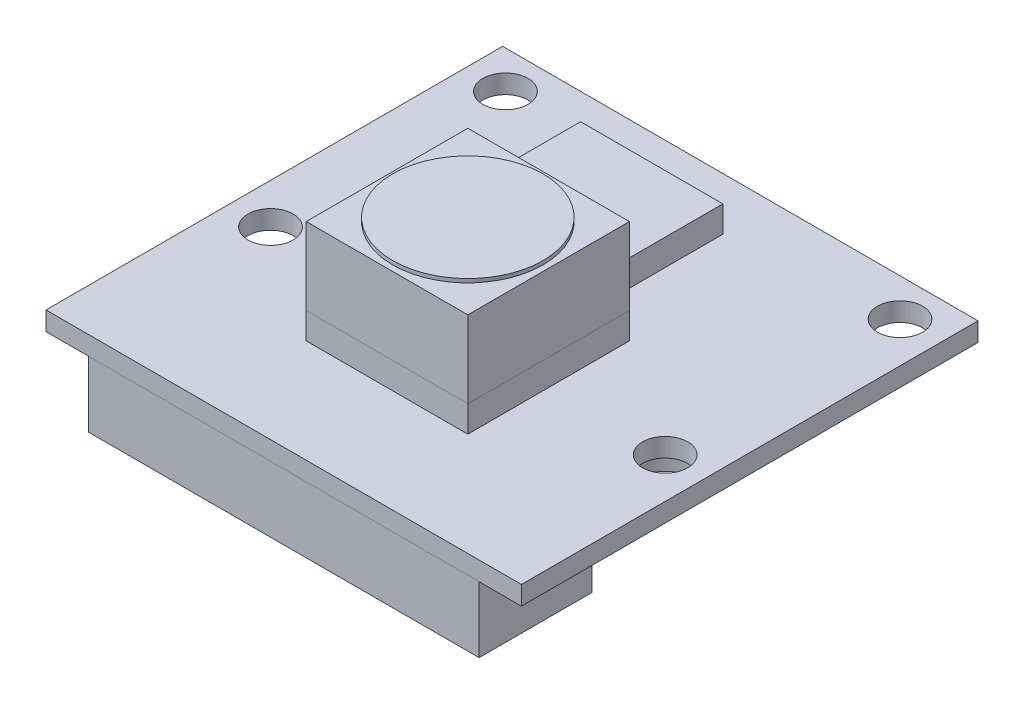
ISO-10303-21;
HEADER;
FILE_DESCRIPTION(('STEP AP214'),'2;1');
FILE_NAME('part.step','',(''),(''),'','','');
FILE_SCHEMA(('AUTOMOTIVE_DESIGN { 1 0 10303 214 1 1 1 1 }'));
ENDSEC;
DATA;
#1=APPLICATION_CONTEXT('core data for automotive mechanical design processes');
#2=APPLICATION_PROTOCOL_DEFINITION('international standard','automotive_design',2000,#1);
#3=PRODUCT_CONTEXT('',#1,'mechanical');
#4=PRODUCT('Part','Part','',(#3));
#5=PRODUCT_RELATED_PRODUCT_CATEGORY('part','',(#4));
#6=PRODUCT_DEFINITION_FORMATION('','',#4);
#7=PRODUCT_DEFINITION_CONTEXT('part definition',#1,'design');
#8=PRODUCT_DEFINITION('design','',#6,#7);
#9=PRODUCT_DEFINITION_SHAPE('','',#8);
#10=(LENGTH_UNIT() NAMED_UNIT(*) SI_UNIT(.MILLI.,.METRE.));
#11=(NAMED_UNIT(*) PLANE_ANGLE_UNIT() SI_UNIT($,.RADIAN.));
#12=(NAMED_UNIT(*) SI_UNIT($,.STERADIAN.) SOLID_ANGLE_UNIT());
#13=UNCERTAINTY_MEASURE_WITH_UNIT(LENGTH_MEASURE(1.E-05),#10,'distance_accuracy_value','');
#14=(GEOMETRIC_REPRESENTATION_CONTEXT(3) GLOBAL_UNCERTAINTY_ASSIGNED_CONTEXT((#13)) GLOBAL_UNIT_ASSIGNED_CONTEXT((#10,
#11,#12)) REPRESENTATION_CONTEXT('',''));
#15=CARTESIAN_POINT('',(0.,0.,0.));
#16=DIRECTION('',(0.,0.,1.));
#17=DIRECTION('',(1.,0.,0.));
#18=AXIS2_PLACEMENT_3D('',#15,#16,#17);
#19=CARTESIAN_POINT('',(-10.5,-1.5,-10.15));
#20=DIRECTION('',(0.,1.,0.));
#21=DIRECTION('',(0.,0.,1.));
#22=AXIS2_PLACEMENT_3D('',#19,#20,#21);
#23=CYLINDRICAL_SURFACE('',#22,2.45);
#24=CARTESIAN_POINT('',(-10.5,0.,-10.15));
#25=DIRECTION('',(0.,1.,0.));
#26=DIRECTION('',(0.,0.,-1.));
#27=AXIS2_PLACEMENT_3D('',#24,#25,#26);
#28=CIRCLE('',#27,2.45);
#29=CARTESIAN_POINT('',(-10.5,0.,-7.7));
#30=VERTEX_POINT('',#29);
#31=CARTESIAN_POINT('',(-8.05,0.,-10.15));
#32=VERTEX_POINT('',#31);
#33=EDGE_CURVE('E140',#30,#32,#28,.T.);
#34=ORIENTED_EDGE('',*,*,#33,.T.);
#35=DIRECTION('',(0.,1.,0.));
#36=VECTOR('',#35,1.);
#37=CARTESIAN_POINT('',(-8.05,-1.5,-10.15));
#38=LINE('',#37,#36);
#39=CARTESIAN_POINT('',(-8.05,-1.5,-10.15));
#40=VERTEX_POINT('',#39);
#41=EDGE_CURVE('E12',#40,#32,#38,.T.);
#42=ORIENTED_EDGE('',*,*,#41,.F.);
#43=CARTESIAN_POINT('',(-10.5,-1.5,-10.15));
#44=DIRECTION('',(0.,1.,0.));
#45=DIRECTION('',(0.,0.,-1.));
#46=AXIS2_PLACEMENT_3D('',#43,#44,#45);
#47=CIRCLE('',#46,2.45);
#48=CARTESIAN_POINT('',(-10.5,-1.5,-7.7));
#49=VERTEX_POINT('',#48);
#50=EDGE_CURVE('E154',#49,#40,#47,.T.);
#51=ORIENTED_EDGE('',*,*,#50,.F.);
#52=DIRECTION('',(0.,1.,0.));
#53=VECTOR('',#52,1.);
#54=CARTESIAN_POINT('',(-10.5,-1.5,-7.7));
#55=LINE('',#54,#53);
#56=EDGE_CURVE('E136',#49,#30,#55,.T.);
#57=ORIENTED_EDGE('',*,*,#56,.T.);
#58=EDGE_LOOP('',(#34,#42,#51,#57));
#59=FACE_BOUND('',#58,.T.);
#60=ADVANCED_FACE('F44',(#59),#23,.F.);
#61=CARTESIAN_POINT('',(-8.05,-1.5,-10.15));
#62=DIRECTION('',(0.,0.,1.));
#63=DIRECTION('',(1.,0.,0.));
#64=AXIS2_PLACEMENT_3D('',#61,#62,#63);
#65=PLANE('',#64);
#66=DIRECTION('',(1.,0.,0.));
#67=VECTOR('',#66,1.);
#68=CARTESIAN_POINT('',(-8.05,0.,-10.15));
#69=LINE('',#68,#67);
#70=CARTESIAN_POINT('',(8.05,0.,-10.15));
#71=VERTEX_POINT('',#70);
#72=EDGE_CURVE('E143',#32,#71,#69,.T.);
#73=ORIENTED_EDGE('',*,*,#72,.T.);
#74=DIRECTION('',(0.,1.,0.));
#75=VECTOR('',#74,1.);
#76=CARTESIAN_POINT('',(8.05,-1.5,-10.15));
#77=LINE('',#76,#75);
#78=CARTESIAN_POINT('',(8.05,-1.5,-10.15));
#79=VERTEX_POINT('',#78);
#80=EDGE_CURVE('E52',#79,#71,#77,.T.);
#81=ORIENTED_EDGE('',*,*,#80,.F.);
#82=DIRECTION('',(1.,0.,0.));
#83=VECTOR('',#82,1.);
#84=CARTESIAN_POINT('',(-8.05,-1.5,-10.15));
#85=LINE('',#84,#83);
#86=EDGE_CURVE('E103',#40,#79,#85,.T.);
#87=ORIENTED_EDGE('',*,*,#86,.F.);
#88=ORIENTED_EDGE('',*,*,#41,.T.);
#89=EDGE_LOOP('',(#73,#81,#87,#88));
#90=FACE_BOUND('',#89,.T.);
#91=ADVANCED_FACE('F189',(#90),#65,.F.);
#92=CARTESIAN_POINT('',(10.5,-1.5,-10.15));
#93=DIRECTION('',(0.,1.,0.));
#94=DIRECTION('',(0.,0.,1.));
#95=AXIS2_PLACEMENT_3D('',#92,#93,#94);
#96=CYLINDRICAL_SURFACE('',#95,2.45);
#97=CARTESIAN_POINT('',(10.5,0.,-10.15));
#98=DIRECTION('',(0.,1.,0.));
#99=DIRECTION('',(0.,0.,-1.));
#100=AXIS2_PLACEMENT_3D('',#97,#98,#99);
#101=CIRCLE('',#100,2.45);
#102=CARTESIAN_POINT('',(10.5,0.,-7.7));
#103=VERTEX_POINT('',#102);
#104=EDGE_CURVE('E145',#71,#103,#101,.T.);
#105=ORIENTED_EDGE('',*,*,#104,.T.);
#106=DIRECTION('',(0.,1.,0.));
#107=VECTOR('',#106,1.);
#108=CARTESIAN_POINT('',(10.5,-1.5,-7.7));
#109=LINE('',#108,#107);
#110=CARTESIAN_POINT('',(10.5,-1.5,-7.7));
#111=VERTEX_POINT('',#110);
#112=EDGE_CURVE('E161',#111,#103,#109,.T.);
#113=ORIENTED_EDGE('',*,*,#112,.F.);
#114=CARTESIAN_POINT('',(10.5,-1.5,-10.15));
#115=DIRECTION('',(0.,1.,0.));
#116=DIRECTION('',(0.,0.,-1.));
#117=AXIS2_PLACEMENT_3D('',#114,#115,#116);
#118=CIRCLE('',#117,2.45);
#119=EDGE_CURVE('E169',#79,#111,#118,.T.);
#120=ORIENTED_EDGE('',*,*,#119,.F.);
#121=ORIENTED_EDGE('',*,*,#80,.T.);
#122=EDGE_LOOP('',(#105,#113,#120,#121));
#123=FACE_BOUND('',#122,.T.);
#124=ADVANCED_FACE('F167',(#123),#96,.F.);
#125=CARTESIAN_POINT('',(10.5,-1.5,-7.7));
#126=DIRECTION('',(-1.,0.,0.));
#127=DIRECTION('',(0.,0.,1.));
#128=AXIS2_PLACEMENT_3D('',#125,#126,#127);
#129=PLANE('',#128);
#130=DIRECTION('',(0.,0.,1.));
#131=VECTOR('',#130,1.);
#132=CARTESIAN_POINT('',(10.5,0.,-7.7));
#133=LINE('',#132,#131);
#134=CARTESIAN_POINT('',(10.5,0.,-0.100000000000003));
#135=VERTEX_POINT('',#134);
#136=EDGE_CURVE('E147',#103,#135,#133,.T.);
#137=ORIENTED_EDGE('',*,*,#136,.T.);
#138=DIRECTION('',(0.,1.,0.));
#139=VECTOR('',#138,1.);
#140=CARTESIAN_POINT('',(10.5,-1.5,-0.100000000000003));
#141=LINE('',#140,#139);
#142=CARTESIAN_POINT('',(10.5,-1.5,-0.100000000000003));
#143=VERTEX_POINT('',#142);
#144=EDGE_CURVE('E158',#143,#135,#141,.T.);
#145=ORIENTED_EDGE('',*,*,#144,.F.);
#146=DIRECTION('',(0.,0.,1.));
#147=VECTOR('',#146,1.);
#148=CARTESIAN_POINT('',(10.5,-1.5,-7.7));
#149=LINE('',#148,#147);
#150=EDGE_CURVE('E181',#111,#143,#149,.T.);
#151=ORIENTED_EDGE('',*,*,#150,.F.);
#152=ORIENTED_EDGE('',*,*,#112,.T.);
#153=EDGE_LOOP('',(#137,#145,#151,#152));
#154=FACE_BOUND('',#153,.T.);
#155=ADVANCED_FACE('F177',(#154),#129,.F.);
#156=CARTESIAN_POINT('',(10.5,-1.5,2.35));
#157=DIRECTION('',(0.,1.,0.));
#158=DIRECTION('',(0.,0.,1.));
#159=AXIS2_PLACEMENT_3D('',#156,#157,#158);
#160=CYLINDRICAL_SURFACE('',#159,2.45);
#161=CARTESIAN_POINT('',(10.5,0.,2.35));
#162=DIRECTION('',(0.,1.,0.));
#163=DIRECTION('',(0.,0.,-1.));
#164=AXIS2_PLACEMENT_3D('',#161,#162,#163);
#165=CIRCLE('',#164,2.45);
#166=CARTESIAN_POINT('',(8.05,0.,2.35));
#167=VERTEX_POINT('',#166);
#168=EDGE_CURVE('E149',#135,#167,#165,.T.);
#169=ORIENTED_EDGE('',*,*,#168,.T.);
#170=DIRECTION('',(0.,1.,0.));
#171=VECTOR('',#170,1.);
#172=CARTESIAN_POINT('',(8.05,-1.5,2.35));
#173=LINE('',#172,#171);
#174=CARTESIAN_POINT('',(8.05,-1.5,2.35));
#175=VERTEX_POINT('',#174);
#176=EDGE_CURVE('E131',#175,#167,#173,.T.);
#177=ORIENTED_EDGE('',*,*,#176,.F.);
#178=CARTESIAN_POINT('',(10.5,-1.5,2.35));
#179=DIRECTION('',(0.,1.,0.));
#180=DIRECTION('',(0.,0.,-1.));
#181=AXIS2_PLACEMENT_3D('',#178,#179,#180);
#182=CIRCLE('',#181,2.45);
#183=EDGE_CURVE('E122',#143,#175,#182,.T.);
#184=ORIENTED_EDGE('',*,*,#183,.F.);
#185=ORIENTED_EDGE('',*,*,#144,.T.);
#186=EDGE_LOOP('',(#169,#177,#184,#185));
#187=FACE_BOUND('',#186,.T.);
#188=ADVANCED_FACE('F180',(#187),#160,.F.);
#189=CARTESIAN_POINT('',(8.05,-1.5,2.35));
#190=DIRECTION('',(0.,0.,-1.));
#191=DIRECTION('',(-1.,0.,0.));
#192=AXIS2_PLACEMENT_3D('',#189,#190,#191);
#193=PLANE('',#192);
#194=DIRECTION('',(-1.,0.,0.));
#195=VECTOR('',#194,1.);
#196=CARTESIAN_POINT('',(8.05,0.,2.35));
#197=LINE('',#196,#195);
#198=CARTESIAN_POINT('',(-8.05,0.,2.35));
#199=VERTEX_POINT('',#198);
#200=EDGE_CURVE('E130',#167,#199,#197,.T.);
#201=ORIENTED_EDGE('',*,*,#200,.T.);
#202=DIRECTION('',(0.,1.,0.));
#203=VECTOR('',#202,1.);
#204=CARTESIAN_POINT('',(-8.05,-1.5,2.35));
#205=LINE('',#204,#203);
#206=CARTESIAN_POINT('',(-8.05,-1.5,2.35));
#207=VERTEX_POINT('',#206);
#208=EDGE_CURVE('E127',#207,#199,#205,.T.);
#209=ORIENTED_EDGE('',*,*,#208,.F.);
#210=DIRECTION('',(-1.,0.,0.));
#211=VECTOR('',#210,1.);
#212=CARTESIAN_POINT('',(8.05,-1.5,2.35));
#213=LINE('',#212,#211);
#214=EDGE_CURVE('E116',#175,#207,#213,.T.);
#215=ORIENTED_EDGE('',*,*,#214,.F.);
#216=ORIENTED_EDGE('',*,*,#176,.T.);
#217=EDGE_LOOP('',(#201,#209,#215,#216));
#218=FACE_BOUND('',#217,.T.);
#219=ADVANCED_FACE('F128',(#218),#193,.F.);
#220=CARTESIAN_POINT('',(-10.5,-1.5,2.35));
#221=DIRECTION('',(0.,1.,0.));
#222=DIRECTION('',(0.,0.,1.));
#223=AXIS2_PLACEMENT_3D('',#220,#221,#222);
#224=CYLINDRICAL_SURFACE('',#223,2.45);
#225=CARTESIAN_POINT('',(-10.5,0.,2.35));
#226=DIRECTION('',(0.,1.,0.));
#227=DIRECTION('',(0.,0.,-1.));
#228=AXIS2_PLACEMENT_3D('',#225,#226,#227);
#229=CIRCLE('',#228,2.45);
#230=CARTESIAN_POINT('',(-10.5,0.,-0.100000000000003));
#231=VERTEX_POINT('',#230);
#232=EDGE_CURVE('E89',#199,#231,#229,.T.);
#233=ORIENTED_EDGE('',*,*,#232,.T.);
#234=DIRECTION('',(0.,1.,0.));
#235=VECTOR('',#234,1.);
#236=CARTESIAN_POINT('',(-10.5,-1.5,-0.100000000000003));
#237=LINE('',#236,#235);
#238=CARTESIAN_POINT('',(-10.5,-1.5,-0.100000000000003));
#239=VERTEX_POINT('',#238);
#240=EDGE_CURVE('E132',#239,#231,#237,.T.);
#241=ORIENTED_EDGE('',*,*,#240,.F.);
#242=CARTESIAN_POINT('',(-10.5,-1.5,2.35));
#243=DIRECTION('',(0.,1.,0.));
#244=DIRECTION('',(0.,0.,-1.));
#245=AXIS2_PLACEMENT_3D('',#242,#243,#244);
#246=CIRCLE('',#245,2.45);
#247=EDGE_CURVE('E120',#207,#239,#246,.T.);
#248=ORIENTED_EDGE('',*,*,#247,.F.);
#249=ORIENTED_EDGE('',*,*,#208,.T.);
#250=EDGE_LOOP('',(#233,#241,#248,#249));
#251=FACE_BOUND('',#250,.T.);
#252=ADVANCED_FACE('F134',(#251),#224,.F.);
#253=CARTESIAN_POINT('',(-10.5,-1.5,-0.100000000000003));
#254=DIRECTION('',(1.,0.,0.));
#255=DIRECTION('',(0.,0.,-1.));
#256=AXIS2_PLACEMENT_3D('',#253,#254,#255);
#257=PLANE('',#256);
#258=DIRECTION('',(0.,0.,-1.));
#259=VECTOR('',#258,1.);
#260=CARTESIAN_POINT('',(-10.5,0.,-0.100000000000003));
#261=LINE('',#260,#259);
#262=EDGE_CURVE('E95',#231,#30,#261,.T.);
#263=ORIENTED_EDGE('',*,*,#262,.T.);
#264=ORIENTED_EDGE('',*,*,#56,.F.);
#265=DIRECTION('',(0.,0.,-1.));
#266=VECTOR('',#265,1.);
#267=CARTESIAN_POINT('',(-10.5,-1.5,-0.100000000000003));
#268=LINE('',#267,#266);
#269=EDGE_CURVE('E60',#239,#49,#268,.T.);
#270=ORIENTED_EDGE('',*,*,#269,.F.);
#271=ORIENTED_EDGE('',*,*,#240,.T.);
#272=EDGE_LOOP('',(#263,#264,#270,#271));
#273=FACE_BOUND('',#272,.T.);
#274=ADVANCED_FACE('F205',(#273),#257,.F.);
#275=CARTESIAN_POINT('',(-10.5,-1.5,-10.15));
#276=DIRECTION('',(0.,-1.,0.));
#277=DIRECTION('',(0.,0.,-1.));
#278=AXIS2_PLACEMENT_3D('',#275,#276,#277);
#279=PLANE('',#278);
#280=ORIENTED_EDGE('',*,*,#50,.T.);
#281=ORIENTED_EDGE('',*,*,#86,.T.);
#282=ORIENTED_EDGE('',*,*,#119,.T.);
#283=ORIENTED_EDGE('',*,*,#150,.T.);
#284=ORIENTED_EDGE('',*,*,#183,.T.);
#285=ORIENTED_EDGE('',*,*,#214,.T.);
#286=ORIENTED_EDGE('',*,*,#247,.T.);
#287=ORIENTED_EDGE('',*,*,#269,.T.);
#288=EDGE_LOOP('',(#280,#281,#282,#283,#284,#285,#286,#287));
#289=FACE_BOUND('',#288,.T.);
#290=ADVANCED_FACE('F118',(#289),#279,.T.);
#291=CARTESIAN_POINT('',(-10.5,0.,-10.15));
#292=DIRECTION('',(0.,-1.,0.));
#293=DIRECTION('',(0.,0.,-1.));
#294=AXIS2_PLACEMENT_3D('',#291,#292,#293);
#295=PLANE('',#294);
#296=ORIENTED_EDGE('',*,*,#33,.F.);
#297=ORIENTED_EDGE('',*,*,#262,.F.);
#298=ORIENTED_EDGE('',*,*,#232,.F.);
#299=ORIENTED_EDGE('',*,*,#200,.F.);
#300=ORIENTED_EDGE('',*,*,#168,.F.);
#301=ORIENTED_EDGE('',*,*,#136,.F.);
#302=ORIENTED_EDGE('',*,*,#104,.F.);
#303=ORIENTED_EDGE('',*,*,#72,.F.);
#304=EDGE_LOOP('',(#296,#297,#298,#299,#300,#301,#302,#303));
#305=FACE_BOUND('',#304,.T.);
#306=ADVANCED_FACE('F173',(#305),#295,.F.);
#307=CLOSED_SHELL('',(#60,#91,#124,#155,#188,#219,#252,#274,#290,#306));
#308=MANIFOLD_SOLID_BREP('B2',#307);
#309=CARTESIAN_POINT('',(10.4,-3.5,6.15));
#310=DIRECTION('',(-1.,0.,0.));
#311=DIRECTION('',(0.,0.,1.));
#312=AXIS2_PLACEMENT_3D('',#309,#310,#311);
#313=PLANE('',#312);
#314=DIRECTION('',(0.,0.,1.));
#315=VECTOR('',#314,1.);
#316=CARTESIAN_POINT('',(10.4,0.,6.15));
#317=LINE('',#316,#315);
#318=CARTESIAN_POINT('',(10.4,0.,6.15));
#319=VERTEX_POINT('',#318);
#320=CARTESIAN_POINT('',(10.4,0.,12.15));
#321=VERTEX_POINT('',#320);
#322=EDGE_CURVE('E342',#319,#321,#317,.T.);
#323=ORIENTED_EDGE('',*,*,#322,.T.);
#324=DIRECTION('',(0.,1.,0.));
#325=VECTOR('',#324,1.);
#326=CARTESIAN_POINT('',(10.4,-3.5,12.15));
#327=LINE('',#326,#325);
#328=CARTESIAN_POINT('',(10.4,-3.5,12.15));
#329=VERTEX_POINT('',#328);
#330=EDGE_CURVE('E42',#329,#321,#327,.T.);
#331=ORIENTED_EDGE('',*,*,#330,.F.);
#332=DIRECTION('',(0.,0.,1.));
#333=VECTOR('',#332,1.);
#334=CARTESIAN_POINT('',(10.4,-3.5,6.15));
#335=LINE('',#334,#333);
#336=CARTESIAN_POINT('',(10.4,-3.5,6.15));
#337=VERTEX_POINT('',#336);
#338=EDGE_CURVE('E330',#337,#329,#335,.T.);
#339=ORIENTED_EDGE('',*,*,#338,.F.);
#340=DIRECTION('',(0.,1.,0.));
#341=VECTOR('',#340,1.);
#342=CARTESIAN_POINT('',(10.4,-3.5,6.15));
#343=LINE('',#342,#341);
#344=EDGE_CURVE('E338',#337,#319,#343,.T.);
#345=ORIENTED_EDGE('',*,*,#344,.T.);
#346=EDGE_LOOP('',(#323,#331,#339,#345));
#347=FACE_BOUND('',#346,.T.);
#348=ADVANCED_FACE('F279',(#347),#313,.F.);
#349=CARTESIAN_POINT('',(10.4,-3.5,12.15));
#350=DIRECTION('',(0.,0.,-1.));
#351=DIRECTION('',(-1.,0.,0.));
#352=AXIS2_PLACEMENT_3D('',#349,#350,#351);
#353=PLANE('',#352);
#354=DIRECTION('',(-1.,0.,0.));
#355=VECTOR('',#354,1.);
#356=CARTESIAN_POINT('',(10.4,0.,12.15));
#357=LINE('',#356,#355);
#358=CARTESIAN_POINT('',(-10.4,0.,12.15));
#359=VERTEX_POINT('',#358);
#360=EDGE_CURVE('E334',#321,#359,#357,.T.);
#361=ORIENTED_EDGE('',*,*,#360,.T.);
#362=DIRECTION('',(0.,1.,0.));
#363=VECTOR('',#362,1.);
#364=CARTESIAN_POINT('',(-10.4,-3.5,12.15));
#365=LINE('',#364,#363);
#366=CARTESIAN_POINT('',(-10.4,-3.5,12.15));
#367=VERTEX_POINT('',#366);
#368=EDGE_CURVE('E287',#367,#359,#365,.T.);
#369=ORIENTED_EDGE('',*,*,#368,.F.);
#370=DIRECTION('',(-1.,0.,0.));
#371=VECTOR('',#370,1.);
#372=CARTESIAN_POINT('',(10.4,-3.5,12.15));
#373=LINE('',#372,#371);
#374=EDGE_CURVE('E325',#329,#367,#373,.T.);
#375=ORIENTED_EDGE('',*,*,#374,.F.);
#376=ORIENTED_EDGE('',*,*,#330,.T.);
#377=EDGE_LOOP('',(#361,#369,#375,#376));
#378=FACE_BOUND('',#377,.T.);
#379=ADVANCED_FACE('F333',(#378),#353,.F.);
#380=CARTESIAN_POINT('',(-10.4,-3.5,6.15));
#381=DIRECTION('',(1.,0.,0.));
#382=DIRECTION('',(0.,0.,-1.));
#383=AXIS2_PLACEMENT_3D('',#380,#381,#382);
#384=PLANE('',#383);
#385=DIRECTION('',(0.,0.,-1.));
#386=VECTOR('',#385,1.);
#387=CARTESIAN_POINT('',(-10.4,0.,6.15));
#388=LINE('',#387,#386);
#389=CARTESIAN_POINT('',(-10.4,0.,6.15));
#390=VERTEX_POINT('',#389);
#391=EDGE_CURVE('E312',#359,#390,#388,.T.);
#392=ORIENTED_EDGE('',*,*,#391,.T.);
#393=DIRECTION('',(0.,1.,0.));
#394=VECTOR('',#393,1.);
#395=CARTESIAN_POINT('',(-10.4,-3.5,6.15));
#396=LINE('',#395,#394);
#397=CARTESIAN_POINT('',(-10.4,-3.5,6.15));
#398=VERTEX_POINT('',#397);
#399=EDGE_CURVE('E335',#398,#390,#396,.T.);
#400=ORIENTED_EDGE('',*,*,#399,.F.);
#401=DIRECTION('',(0.,0.,-1.));
#402=VECTOR('',#401,1.);
#403=CARTESIAN_POINT('',(-10.4,-3.5,6.15));
#404=LINE('',#403,#402);
#405=EDGE_CURVE('E328',#367,#398,#404,.T.);
#406=ORIENTED_EDGE('',*,*,#405,.F.);
#407=ORIENTED_EDGE('',*,*,#368,.T.);
#408=EDGE_LOOP('',(#392,#400,#406,#407));
#409=FACE_BOUND('',#408,.T.);
#410=ADVANCED_FACE('F336',(#409),#384,.F.);
#411=CARTESIAN_POINT('',(10.4,-3.5,6.15));
#412=DIRECTION('',(0.,0.,1.));
#413=DIRECTION('',(1.,0.,0.));
#414=AXIS2_PLACEMENT_3D('',#411,#412,#413);
#415=PLANE('',#414);
#416=DIRECTION('',(1.,0.,0.));
#417=VECTOR('',#416,1.);
#418=CARTESIAN_POINT('',(10.4,0.,6.15));
#419=LINE('',#418,#417);
#420=EDGE_CURVE('E318',#390,#319,#419,.T.);
#421=ORIENTED_EDGE('',*,*,#420,.T.);
#422=ORIENTED_EDGE('',*,*,#344,.F.);
#423=DIRECTION('',(1.,0.,0.));
#424=VECTOR('',#423,1.);
#425=CARTESIAN_POINT('',(10.4,-3.5,6.15));
#426=LINE('',#425,#424);
#427=EDGE_CURVE('E295',#398,#337,#426,.T.);
#428=ORIENTED_EDGE('',*,*,#427,.F.);
#429=ORIENTED_EDGE('',*,*,#399,.T.);
#430=EDGE_LOOP('',(#421,#422,#428,#429));
#431=FACE_BOUND('',#430,.T.);
#432=ADVANCED_FACE('F349',(#431),#415,.F.);
#433=CARTESIAN_POINT('',(0.,-3.5,0.));
#434=DIRECTION('',(0.,-1.,0.));
#435=DIRECTION('',(0.,0.,-1.));
#436=AXIS2_PLACEMENT_3D('',#433,#434,#435);
#437=PLANE('',#436);
#438=ORIENTED_EDGE('',*,*,#338,.T.);
#439=ORIENTED_EDGE('',*,*,#374,.T.);
#440=ORIENTED_EDGE('',*,*,#405,.T.);
#441=ORIENTED_EDGE('',*,*,#427,.T.);
#442=EDGE_LOOP('',(#438,#439,#440,#441));
#443=FACE_BOUND('',#442,.T.);
#444=ADVANCED_FACE('F326',(#443),#437,.T.);
#445=CARTESIAN_POINT('',(0.,0.,0.));
#446=DIRECTION('',(0.,-1.,0.));
#447=DIRECTION('',(0.,0.,-1.));
#448=AXIS2_PLACEMENT_3D('',#445,#446,#447);
#449=PLANE('',#448);
#450=ORIENTED_EDGE('',*,*,#322,.F.);
#451=ORIENTED_EDGE('',*,*,#420,.F.);
#452=ORIENTED_EDGE('',*,*,#391,.F.);
#453=ORIENTED_EDGE('',*,*,#360,.F.);
#454=EDGE_LOOP('',(#450,#451,#452,#453));
#455=FACE_BOUND('',#454,.T.);
#456=ADVANCED_FACE('F352',(#455),#449,.F.);
#457=CLOSED_SHELL('',(#348,#379,#410,#432,#444,#456));
#458=MANIFOLD_SOLID_BREP('B6',#457);
#459=CARTESIAN_POINT('',(0.,6.7,2.35));
#460=DIRECTION('',(0.,-1.,0.));
#461=DIRECTION('',(0.,0.,-1.));
#462=AXIS2_PLACEMENT_3D('',#459,#460,#461);
#463=CYLINDRICAL_SURFACE('',#462,4.);
#464=CARTESIAN_POINT('',(0.,6.7,2.35));
#465=DIRECTION('',(0.,1.,0.));
#466=DIRECTION('',(0.,0.,1.));
#467=AXIS2_PLACEMENT_3D('',#464,#465,#466);
#468=CIRCLE('',#467,4.);
#469=CARTESIAN_POINT('',(0.,6.7,6.35));
#470=VERTEX_POINT('',#469);
#471=EDGE_CURVE('E278',#470,#470,#468,.T.);
#472=ORIENTED_EDGE('',*,*,#471,.F.);
#473=EDGE_LOOP('',(#472));
#474=FACE_BOUND('',#473,.T.);
#475=CARTESIAN_POINT('',(0.,6.5,2.35));
#476=DIRECTION('',(0.,1.,0.));
#477=DIRECTION('',(0.,0.,1.));
#478=AXIS2_PLACEMENT_3D('',#475,#476,#477);
#479=CIRCLE('',#478,4.);
#480=CARTESIAN_POINT('',(0.,6.5,6.35));
#481=VERTEX_POINT('',#480);
#482=EDGE_CURVE('E415',#481,#481,#479,.T.);
#483=ORIENTED_EDGE('',*,*,#482,.T.);
#484=EDGE_LOOP('',(#483));
#485=FACE_BOUND('',#484,.T.);
#486=ADVANCED_FACE('F412',(#474,#485),#463,.T.);
#487=CARTESIAN_POINT('',(0.,6.7,2.35));
#488=DIRECTION('',(0.,1.,0.));
#489=DIRECTION('',(0.,0.,1.));
#490=AXIS2_PLACEMENT_3D('',#487,#488,#489);
#491=PLANE('',#490);
#492=ORIENTED_EDGE('',*,*,#471,.T.);
#493=EDGE_LOOP('',(#492));
#494=FACE_BOUND('',#493,.T.);
#495=ADVANCED_FACE('F427',(#494),#491,.T.);
#496=CARTESIAN_POINT('',(0.,6.5,2.35));
#497=DIRECTION('',(0.,1.,0.));
#498=DIRECTION('',(0.,0.,1.));
#499=AXIS2_PLACEMENT_3D('',#496,#497,#498);
#500=PLANE('',#499);
#501=ORIENTED_EDGE('',*,*,#482,.F.);
#502=EDGE_LOOP('',(#501));
#503=FACE_BOUND('',#502,.T.);
#504=ADVANCED_FACE('F425',(#503),#500,.F.);
#505=CLOSED_SHELL('',(#486,#495,#504));
#506=MANIFOLD_SOLID_BREP('B36',#505);
#507=CARTESIAN_POINT('',(4.3,6.5,-1.95));
#508=DIRECTION('',(-1.,0.,0.));
#509=DIRECTION('',(0.,0.,1.));
#510=AXIS2_PLACEMENT_3D('',#507,#508,#509);
#511=PLANE('',#510);
#512=DIRECTION('',(0.,0.,-1.));
#513=VECTOR('',#512,1.);
#514=CARTESIAN_POINT('',(4.3,2.4,-1.95));
#515=LINE('',#514,#513);
#516=CARTESIAN_POINT('',(4.3,2.4,6.65));
#517=VERTEX_POINT('',#516);
#518=CARTESIAN_POINT('',(4.3,2.4,-1.95));
#519=VERTEX_POINT('',#518);
#520=EDGE_CURVE('E525',#517,#519,#515,.T.);
#521=ORIENTED_EDGE('',*,*,#520,.T.);
#522=DIRECTION('',(0.,-1.,0.));
#523=VECTOR('',#522,1.);
#524=CARTESIAN_POINT('',(4.3,6.5,-1.95));
#525=LINE('',#524,#523);
#526=CARTESIAN_POINT('',(4.3,6.5,-1.95));
#527=VERTEX_POINT('',#526);
#528=EDGE_CURVE('E410',#527,#519,#525,.T.);
#529=ORIENTED_EDGE('',*,*,#528,.F.);
#530=DIRECTION('',(0.,0.,-1.));
#531=VECTOR('',#530,1.);
#532=CARTESIAN_POINT('',(4.3,6.5,-1.95));
#533=LINE('',#532,#531);
#534=CARTESIAN_POINT('',(4.3,6.5,6.65));
#535=VERTEX_POINT('',#534);
#536=EDGE_CURVE('E513',#535,#527,#533,.T.);
#537=ORIENTED_EDGE('',*,*,#536,.F.);
#538=DIRECTION('',(0.,-1.,0.));
#539=VECTOR('',#538,1.);
#540=CARTESIAN_POINT('',(4.3,6.5,6.65));
#541=LINE('',#540,#539);
#542=EDGE_CURVE('E521',#535,#517,#541,.T.);
#543=ORIENTED_EDGE('',*,*,#542,.T.);
#544=EDGE_LOOP('',(#521,#529,#537,#543));
#545=FACE_BOUND('',#544,.T.);
#546=ADVANCED_FACE('F462',(#545),#511,.F.);
#547=CARTESIAN_POINT('',(4.3,6.5,-1.95));
#548=DIRECTION('',(0.,0.,1.));
#549=DIRECTION('',(1.,0.,0.));
#550=AXIS2_PLACEMENT_3D('',#547,#548,#549);
#551=PLANE('',#550);
#552=DIRECTION('',(-1.,0.,0.));
#553=VECTOR('',#552,1.);
#554=CARTESIAN_POINT('',(4.3,2.4,-1.95));
#555=LINE('',#554,#553);
#556=CARTESIAN_POINT('',(-4.3,2.4,-1.95));
#557=VERTEX_POINT('',#556);
#558=EDGE_CURVE('E517',#519,#557,#555,.T.);
#559=ORIENTED_EDGE('',*,*,#558,.T.);
#560=DIRECTION('',(0.,-1.,0.));
#561=VECTOR('',#560,1.);
#562=CARTESIAN_POINT('',(-4.3,6.5,-1.95));
#563=LINE('',#562,#561);
#564=CARTESIAN_POINT('',(-4.3,6.5,-1.95));
#565=VERTEX_POINT('',#564);
#566=EDGE_CURVE('E470',#565,#557,#563,.T.);
#567=ORIENTED_EDGE('',*,*,#566,.F.);
#568=DIRECTION('',(-1.,0.,0.));
#569=VECTOR('',#568,1.);
#570=CARTESIAN_POINT('',(4.3,6.5,-1.95));
#571=LINE('',#570,#569);
#572=EDGE_CURVE('E508',#527,#565,#571,.T.);
#573=ORIENTED_EDGE('',*,*,#572,.F.);
#574=ORIENTED_EDGE('',*,*,#528,.T.);
#575=EDGE_LOOP('',(#559,#567,#573,#574));
#576=FACE_BOUND('',#575,.T.);
#577=ADVANCED_FACE('F516',(#576),#551,.F.);
#578=CARTESIAN_POINT('',(-4.3,6.5,-1.95));
#579=DIRECTION('',(1.,0.,0.));
#580=DIRECTION('',(0.,0.,-1.));
#581=AXIS2_PLACEMENT_3D('',#578,#579,#580);
#582=PLANE('',#581);
#583=DIRECTION('',(0.,0.,1.));
#584=VECTOR('',#583,1.);
#585=CARTESIAN_POINT('',(-4.3,2.4,-1.95));
#586=LINE('',#585,#584);
#587=CARTESIAN_POINT('',(-4.3,2.4,6.65));
#588=VERTEX_POINT('',#587);
#589=EDGE_CURVE('E495',#557,#588,#586,.T.);
#590=ORIENTED_EDGE('',*,*,#589,.T.);
#591=DIRECTION('',(0.,-1.,0.));
#592=VECTOR('',#591,1.);
#593=CARTESIAN_POINT('',(-4.3,6.5,6.65));
#594=LINE('',#593,#592);
#595=CARTESIAN_POINT('',(-4.3,6.5,6.65));
#596=VERTEX_POINT('',#595);
#597=EDGE_CURVE('E518',#596,#588,#594,.T.);
#598=ORIENTED_EDGE('',*,*,#597,.F.);
#599=DIRECTION('',(0.,0.,1.));
#600=VECTOR('',#599,1.);
#601=CARTESIAN_POINT('',(-4.3,6.5,-1.95));
#602=LINE('',#601,#600);
#603=EDGE_CURVE('E511',#565,#596,#602,.T.);
#604=ORIENTED_EDGE('',*,*,#603,.F.);
#605=ORIENTED_EDGE('',*,*,#566,.T.);
#606=EDGE_LOOP('',(#590,#598,#604,#605));
#607=FACE_BOUND('',#606,.T.);
#608=ADVANCED_FACE('F519',(#607),#582,.F.);
#609=CARTESIAN_POINT('',(4.3,6.5,6.65));
#610=DIRECTION('',(0.,0.,-1.));
#611=DIRECTION('',(-1.,0.,0.));
#612=AXIS2_PLACEMENT_3D('',#609,#610,#611);
#613=PLANE('',#612);
#614=DIRECTION('',(1.,0.,0.));
#615=VECTOR('',#614,1.);
#616=CARTESIAN_POINT('',(4.3,2.4,6.65));
#617=LINE('',#616,#615);
#618=EDGE_CURVE('E501',#588,#517,#617,.T.);
#619=ORIENTED_EDGE('',*,*,#618,.T.);
#620=ORIENTED_EDGE('',*,*,#542,.F.);
#621=DIRECTION('',(1.,0.,0.));
#622=VECTOR('',#621,1.);
#623=CARTESIAN_POINT('',(4.3,6.5,6.65));
#624=LINE('',#623,#622);
#625=EDGE_CURVE('E478',#596,#535,#624,.T.);
#626=ORIENTED_EDGE('',*,*,#625,.F.);
#627=ORIENTED_EDGE('',*,*,#597,.T.);
#628=EDGE_LOOP('',(#619,#620,#626,#627));
#629=FACE_BOUND('',#628,.T.);
#630=ADVANCED_FACE('F532',(#629),#613,.F.);
#631=CARTESIAN_POINT('',(0.,6.5,0.));
#632=DIRECTION('',(0.,-1.,0.));
#633=DIRECTION('',(0.,0.,-1.));
#634=AXIS2_PLACEMENT_3D('',#631,#632,#633);
#635=PLANE('',#634);
#636=ORIENTED_EDGE('',*,*,#536,.T.);
#637=ORIENTED_EDGE('',*,*,#572,.T.);
#638=ORIENTED_EDGE('',*,*,#603,.T.);
#639=ORIENTED_EDGE('',*,*,#625,.T.);
#640=EDGE_LOOP('',(#636,#637,#638,#639));
#641=FACE_BOUND('',#640,.T.);
#642=ADVANCED_FACE('F509',(#641),#635,.F.);
#643=CARTESIAN_POINT('',(0.,2.4,0.));
#644=DIRECTION('',(0.,-1.,0.));
#645=DIRECTION('',(0.,0.,-1.));
#646=AXIS2_PLACEMENT_3D('',#643,#644,#645);
#647=PLANE('',#646);
#648=ORIENTED_EDGE('',*,*,#520,.F.);
#649=ORIENTED_EDGE('',*,*,#618,.F.);
#650=ORIENTED_EDGE('',*,*,#589,.F.);
#651=ORIENTED_EDGE('',*,*,#558,.F.);
#652=EDGE_LOOP('',(#648,#649,#650,#651));
#653=FACE_BOUND('',#652,.T.);
#654=ADVANCED_FACE('F535',(#653),#647,.T.);
#655=CLOSED_SHELL('',(#546,#577,#608,#630,#642,#654));
#656=MANIFOLD_SOLID_BREP('B273',#655);
#657=CARTESIAN_POINT('',(1.87057759151365,2.4,-9.35));
#658=DIRECTION('',(0.,0.,1.));
#659=DIRECTION('',(1.,0.,0.));
#660=AXIS2_PLACEMENT_3D('',#657,#658,#659);
#661=PLANE('',#660);
#662=DIRECTION('',(-1.,0.,0.));
#663=VECTOR('',#662,1.);
#664=CARTESIAN_POINT('',(1.87057759151365,1.,-9.35));
#665=LINE('',#664,#663);
#666=CARTESIAN_POINT('',(1.87057759151365,1.,-9.35));
#667=VERTEX_POINT('',#666);
#668=CARTESIAN_POINT('',(-5.7,1.,-9.35));
#669=VERTEX_POINT('',#668);
#670=EDGE_CURVE('E690',#667,#669,#665,.T.);
#671=ORIENTED_EDGE('',*,*,#670,.T.);
#672=DIRECTION('',(0.,-1.,0.));
#673=VECTOR('',#672,1.);
#674=CARTESIAN_POINT('',(-5.7,2.4,-9.35));
#675=LINE('',#674,#673);
#676=CARTESIAN_POINT('',(-5.7,2.4,-9.35));
#677=VERTEX_POINT('',#676);
#678=EDGE_CURVE('E460',#677,#669,#675,.T.);
#679=ORIENTED_EDGE('',*,*,#678,.F.);
#680=DIRECTION('',(-1.,0.,0.));
#681=VECTOR('',#680,1.);
#682=CARTESIAN_POINT('',(1.87057759151365,2.4,-9.35));
#683=LINE('',#682,#681);
#684=CARTESIAN_POINT('',(1.87057759151365,2.4,-9.35));
#685=VERTEX_POINT('',#684);
#686=EDGE_CURVE('E704',#685,#677,#683,.T.);
#687=ORIENTED_EDGE('',*,*,#686,.F.);
#688=DIRECTION('',(0.,-1.,0.));
#689=VECTOR('',#688,1.);
#690=CARTESIAN_POINT('',(1.87057759151365,2.4,-9.35));
#691=LINE('',#690,#689);
#692=EDGE_CURVE('E686',#685,#667,#691,.T.);
#693=ORIENTED_EDGE('',*,*,#692,.T.);
#694=EDGE_LOOP('',(#671,#679,#687,#693));
#695=FACE_BOUND('',#694,.T.);
#696=ADVANCED_FACE('F594',(#695),#661,.F.);
#697=CARTESIAN_POINT('',(-5.7,2.4,-9.35));
#698=DIRECTION('',(1.,0.,0.));
#699=DIRECTION('',(0.,0.,-1.));
#700=AXIS2_PLACEMENT_3D('',#697,#698,#699);
#701=PLANE('',#700);
#702=DIRECTION('',(0.,0.,1.));
#703=VECTOR('',#702,1.);
#704=CARTESIAN_POINT('',(-5.7,1.,-9.35));
#705=LINE('',#704,#703);
#706=CARTESIAN_POINT('',(-5.7,1.,-5.84857240568824));
#707=VERTEX_POINT('',#706);
#708=EDGE_CURVE('E693',#669,#707,#705,.T.);
#709=ORIENTED_EDGE('',*,*,#708,.T.);
#710=DIRECTION('',(0.,-1.,0.));
#711=VECTOR('',#710,1.);
#712=CARTESIAN_POINT('',(-5.7,2.4,-5.84857240568824));
#713=LINE('',#712,#711);
#714=CARTESIAN_POINT('',(-5.7,2.4,-5.84857240568824));
#715=VERTEX_POINT('',#714);
#716=EDGE_CURVE('E602',#715,#707,#713,.T.);
#717=ORIENTED_EDGE('',*,*,#716,.F.);
#718=DIRECTION('',(0.,0.,1.));
#719=VECTOR('',#718,1.);
#720=CARTESIAN_POINT('',(-5.7,2.4,-9.35));
#721=LINE('',#720,#719);
#722=EDGE_CURVE('E653',#677,#715,#721,.T.);
#723=ORIENTED_EDGE('',*,*,#722,.F.);
#724=ORIENTED_EDGE('',*,*,#678,.T.);
#725=EDGE_LOOP('',(#709,#717,#723,#724));
#726=FACE_BOUND('',#725,.T.);
#727=ADVANCED_FACE('F739',(#726),#701,.F.);
#728=CARTESIAN_POINT('',(-5.7,2.4,-5.84857240568824));
#729=DIRECTION('',(0.,0.,-1.));
#730=DIRECTION('',(-1.,0.,0.));
#731=AXIS2_PLACEMENT_3D('',#728,#729,#730);
#732=PLANE('',#731);
#733=DIRECTION('',(1.,0.,0.));
#734=VECTOR('',#733,1.);
#735=CARTESIAN_POINT('',(-5.7,1.,-5.84857240568824));
#736=LINE('',#735,#734);
#737=CARTESIAN_POINT('',(-4.3,1.,-5.84857240568824));
#738=VERTEX_POINT('',#737);
#739=EDGE_CURVE('E695',#707,#738,#736,.T.);
#740=ORIENTED_EDGE('',*,*,#739,.T.);
#741=DIRECTION('',(0.,-1.,0.));
#742=VECTOR('',#741,1.);
#743=CARTESIAN_POINT('',(-4.3,2.4,-5.84857240568824));
#744=LINE('',#743,#742);
#745=CARTESIAN_POINT('',(-4.3,2.4,-5.84857240568824));
#746=VERTEX_POINT('',#745);
#747=EDGE_CURVE('E711',#746,#738,#744,.T.);
#748=ORIENTED_EDGE('',*,*,#747,.F.);
#749=DIRECTION('',(1.,0.,0.));
#750=VECTOR('',#749,1.);
#751=CARTESIAN_POINT('',(-5.7,2.4,-5.84857240568824));
#752=LINE('',#751,#750);
#753=EDGE_CURVE('E719',#715,#746,#752,.T.);
#754=ORIENTED_EDGE('',*,*,#753,.F.);
#755=ORIENTED_EDGE('',*,*,#716,.T.);
#756=EDGE_LOOP('',(#740,#748,#754,#755));
#757=FACE_BOUND('',#756,.T.);
#758=ADVANCED_FACE('F717',(#757),#732,.F.);
#759=CARTESIAN_POINT('',(-4.3,2.4,-5.84857240568824));
#760=DIRECTION('',(1.,0.,0.));
#761=DIRECTION('',(0.,0.,-1.));
#762=AXIS2_PLACEMENT_3D('',#759,#760,#761);
#763=PLANE('',#762);
#764=DIRECTION('',(0.,0.,1.));
#765=VECTOR('',#764,1.);
#766=CARTESIAN_POINT('',(-4.3,1.,-5.84857240568824));
#767=LINE('',#766,#765);
#768=CARTESIAN_POINT('',(-4.3,1.,6.65));
#769=VERTEX_POINT('',#768);
#770=EDGE_CURVE('E697',#738,#769,#767,.T.);
#771=ORIENTED_EDGE('',*,*,#770,.T.);
#772=DIRECTION('',(0.,-1.,0.));
#773=VECTOR('',#772,1.);
#774=CARTESIAN_POINT('',(-4.3,2.4,6.65));
#775=LINE('',#774,#773);
#776=CARTESIAN_POINT('',(-4.3,2.4,6.65));
#777=VERTEX_POINT('',#776);
#778=EDGE_CURVE('E708',#777,#769,#775,.T.);
#779=ORIENTED_EDGE('',*,*,#778,.F.);
#780=DIRECTION('',(0.,0.,1.));
#781=VECTOR('',#780,1.);
#782=CARTESIAN_POINT('',(-4.3,2.4,-5.84857240568824));
#783=LINE('',#782,#781);
#784=EDGE_CURVE('E731',#746,#777,#783,.T.);
#785=ORIENTED_EDGE('',*,*,#784,.F.);
#786=ORIENTED_EDGE('',*,*,#747,.T.);
#787=EDGE_LOOP('',(#771,#779,#785,#786));
#788=FACE_BOUND('',#787,.T.);
#789=ADVANCED_FACE('F727',(#788),#763,.F.);
#790=CARTESIAN_POINT('',(-4.3,2.4,6.65));
#791=DIRECTION('',(0.,0.,-1.));
#792=DIRECTION('',(-1.,0.,0.));
#793=AXIS2_PLACEMENT_3D('',#790,#791,#792);
#794=PLANE('',#793);
#795=DIRECTION('',(1.,0.,0.));
#796=VECTOR('',#795,1.);
#797=CARTESIAN_POINT('',(-4.3,1.,6.65));
#798=LINE('',#797,#796);
#799=CARTESIAN_POINT('',(4.3,1.,6.65));
#800=VERTEX_POINT('',#799);
#801=EDGE_CURVE('E699',#769,#800,#798,.T.);
#802=ORIENTED_EDGE('',*,*,#801,.T.);
#803=DIRECTION('',(0.,-1.,0.));
#804=VECTOR('',#803,1.);
#805=CARTESIAN_POINT('',(4.3,2.4,6.65));
#806=LINE('',#805,#804);
#807=CARTESIAN_POINT('',(4.3,2.4,6.65));
#808=VERTEX_POINT('',#807);
#809=EDGE_CURVE('E681',#808,#800,#806,.T.);
#810=ORIENTED_EDGE('',*,*,#809,.F.);
#811=DIRECTION('',(1.,0.,0.));
#812=VECTOR('',#811,1.);
#813=CARTESIAN_POINT('',(-4.3,2.4,6.65));
#814=LINE('',#813,#812);
#815=EDGE_CURVE('E672',#777,#808,#814,.T.);
#816=ORIENTED_EDGE('',*,*,#815,.F.);
#817=ORIENTED_EDGE('',*,*,#778,.T.);
#818=EDGE_LOOP('',(#802,#810,#816,#817));
#819=FACE_BOUND('',#818,.T.);
#820=ADVANCED_FACE('F730',(#819),#794,.F.);
#821=CARTESIAN_POINT('',(4.3,2.4,-1.95));
#822=DIRECTION('',(-1.,0.,0.));
#823=DIRECTION('',(0.,0.,1.));
#824=AXIS2_PLACEMENT_3D('',#821,#822,#823);
#825=PLANE('',#824);
#826=DIRECTION('',(0.,0.,-1.));
#827=VECTOR('',#826,1.);
#828=CARTESIAN_POINT('',(4.3,1.,-1.95));
#829=LINE('',#828,#827);
#830=CARTESIAN_POINT('',(4.3,1.,-1.95));
#831=VERTEX_POINT('',#830);
#832=EDGE_CURVE('E680',#800,#831,#829,.T.);
#833=ORIENTED_EDGE('',*,*,#832,.T.);
#834=DIRECTION('',(0.,-1.,0.));
#835=VECTOR('',#834,1.);
#836=CARTESIAN_POINT('',(4.3,2.4,-1.95));
#837=LINE('',#836,#835);
#838=CARTESIAN_POINT('',(4.3,2.4,-1.95));
#839=VERTEX_POINT('',#838);
#840=EDGE_CURVE('E677',#839,#831,#837,.T.);
#841=ORIENTED_EDGE('',*,*,#840,.F.);
#842=DIRECTION('',(0.,0.,-1.));
#843=VECTOR('',#842,1.);
#844=CARTESIAN_POINT('',(4.3,2.4,-1.95));
#845=LINE('',#844,#843);
#846=EDGE_CURVE('E666',#808,#839,#845,.T.);
#847=ORIENTED_EDGE('',*,*,#846,.F.);
#848=ORIENTED_EDGE('',*,*,#809,.T.);
#849=EDGE_LOOP('',(#833,#841,#847,#848));
#850=FACE_BOUND('',#849,.T.);
#851=ADVANCED_FACE('F678',(#850),#825,.F.);
#852=CARTESIAN_POINT('',(1.87057759151365,2.4,-1.95));
#853=DIRECTION('',(0.,0.,1.));
#854=DIRECTION('',(1.,0.,0.));
#855=AXIS2_PLACEMENT_3D('',#852,#853,#854);
#856=PLANE('',#855);
#857=DIRECTION('',(-1.,0.,0.));
#858=VECTOR('',#857,1.);
#859=CARTESIAN_POINT('',(1.87057759151365,1.,-1.95));
#860=LINE('',#859,#858);
#861=CARTESIAN_POINT('',(1.87057759151365,1.,-1.95));
#862=VERTEX_POINT('',#861);
#863=EDGE_CURVE('E639',#831,#862,#860,.T.);
#864=ORIENTED_EDGE('',*,*,#863,.T.);
#865=DIRECTION('',(0.,-1.,0.));
#866=VECTOR('',#865,1.);
#867=CARTESIAN_POINT('',(1.87057759151365,2.4,-1.95));
#868=LINE('',#867,#866);
#869=CARTESIAN_POINT('',(1.87057759151365,2.4,-1.95));
#870=VERTEX_POINT('',#869);
#871=EDGE_CURVE('E682',#870,#862,#868,.T.);
#872=ORIENTED_EDGE('',*,*,#871,.F.);
#873=DIRECTION('',(-1.,0.,0.));
#874=VECTOR('',#873,1.);
#875=CARTESIAN_POINT('',(1.87057759151365,2.4,-1.95));
#876=LINE('',#875,#874);
#877=EDGE_CURVE('E670',#839,#870,#876,.T.);
#878=ORIENTED_EDGE('',*,*,#877,.F.);
#879=ORIENTED_EDGE('',*,*,#840,.T.);
#880=EDGE_LOOP('',(#864,#872,#878,#879));
#881=FACE_BOUND('',#880,.T.);
#882=ADVANCED_FACE('F684',(#881),#856,.F.);
#883=CARTESIAN_POINT('',(1.87057759151365,2.4,-9.35));
#884=DIRECTION('',(-1.,0.,0.));
#885=DIRECTION('',(0.,0.,1.));
#886=AXIS2_PLACEMENT_3D('',#883,#884,#885);
#887=PLANE('',#886);
#888=DIRECTION('',(0.,0.,-1.));
#889=VECTOR('',#888,1.);
#890=CARTESIAN_POINT('',(1.87057759151365,1.,-9.35));
#891=LINE('',#890,#889);
#892=EDGE_CURVE('E645',#862,#667,#891,.T.);
#893=ORIENTED_EDGE('',*,*,#892,.T.);
#894=ORIENTED_EDGE('',*,*,#692,.F.);
#895=DIRECTION('',(0.,0.,-1.));
#896=VECTOR('',#895,1.);
#897=CARTESIAN_POINT('',(1.87057759151365,2.4,-9.35));
#898=LINE('',#897,#896);
#899=EDGE_CURVE('E610',#870,#685,#898,.T.);
#900=ORIENTED_EDGE('',*,*,#899,.F.);
#901=ORIENTED_EDGE('',*,*,#871,.T.);
#902=EDGE_LOOP('',(#893,#894,#900,#901));
#903=FACE_BOUND('',#902,.T.);
#904=ADVANCED_FACE('F755',(#903),#887,.F.);
#905=CARTESIAN_POINT('',(0.,2.4,0.));
#906=DIRECTION('',(0.,1.,0.));
#907=DIRECTION('',(0.,0.,1.));
#908=AXIS2_PLACEMENT_3D('',#905,#906,#907);
#909=PLANE('',#908);
#910=ORIENTED_EDGE('',*,*,#686,.T.);
#911=ORIENTED_EDGE('',*,*,#722,.T.);
#912=ORIENTED_EDGE('',*,*,#753,.T.);
#913=ORIENTED_EDGE('',*,*,#784,.T.);
#914=ORIENTED_EDGE('',*,*,#815,.T.);
#915=ORIENTED_EDGE('',*,*,#846,.T.);
#916=ORIENTED_EDGE('',*,*,#877,.T.);
#917=ORIENTED_EDGE('',*,*,#899,.T.);
#918=EDGE_LOOP('',(#910,#911,#912,#913,#914,#915,#916,#917));
#919=FACE_BOUND('',#918,.T.);
#920=ADVANCED_FACE('F668',(#919),#909,.T.);
#921=CARTESIAN_POINT('',(0.,1.,0.));
#922=DIRECTION('',(0.,1.,0.));
#923=DIRECTION('',(0.,0.,1.));
#924=AXIS2_PLACEMENT_3D('',#921,#922,#923);
#925=PLANE('',#924);
#926=ORIENTED_EDGE('',*,*,#670,.F.);
#927=ORIENTED_EDGE('',*,*,#892,.F.);
#928=ORIENTED_EDGE('',*,*,#863,.F.);
#929=ORIENTED_EDGE('',*,*,#832,.F.);
#930=ORIENTED_EDGE('',*,*,#801,.F.);
#931=ORIENTED_EDGE('',*,*,#770,.F.);
#932=ORIENTED_EDGE('',*,*,#739,.F.);
#933=ORIENTED_EDGE('',*,*,#708,.F.);
#934=EDGE_LOOP('',(#926,#927,#928,#929,#930,#931,#932,#933));
#935=FACE_BOUND('',#934,.T.);
#936=ADVANCED_FACE('F723',(#935),#925,.F.);
#937=CLOSED_SHELL('',(#696,#727,#758,#789,#820,#851,#882,#904,#920,#936));
#938=MANIFOLD_SOLID_BREP('B404',#937);
#939=CARTESIAN_POINT('',(-12.65,1.,-12.15));
#940=DIRECTION('',(1.,0.,0.));
#941=DIRECTION('',(0.,0.,-1.));
#942=AXIS2_PLACEMENT_3D('',#939,#940,#941);
#943=PLANE('',#942);
#944=DIRECTION('',(0.,0.,1.));
#945=VECTOR('',#944,1.);
#946=CARTESIAN_POINT('',(-12.65,0.,-12.15));
#947=LINE('',#946,#945);
#948=CARTESIAN_POINT('',(-12.65,0.,-12.15));
#949=VERTEX_POINT('',#948);
#950=CARTESIAN_POINT('',(-12.65,0.,12.15));
#951=VERTEX_POINT('',#950);
#952=EDGE_CURVE('E884',#949,#951,#947,.T.);
#953=ORIENTED_EDGE('',*,*,#952,.T.);
#954=DIRECTION('',(0.,-1.,0.));
#955=VECTOR('',#954,1.);
#956=CARTESIAN_POINT('',(-12.65,1.,12.15));
#957=LINE('',#956,#955);
#958=CARTESIAN_POINT('',(-12.65,1.,12.15));
#959=VERTEX_POINT('',#958);
#960=EDGE_CURVE('E592',#959,#951,#957,.T.);
#961=ORIENTED_EDGE('',*,*,#960,.F.);
#962=DIRECTION('',(0.,0.,1.));
#963=VECTOR('',#962,1.);
#964=CARTESIAN_POINT('',(-12.65,1.,-12.15));
#965=LINE('',#964,#963);
#966=CARTESIAN_POINT('',(-12.65,1.,-12.15));
#967=VERTEX_POINT('',#966);
#968=EDGE_CURVE('E872',#967,#959,#965,.T.);
#969=ORIENTED_EDGE('',*,*,#968,.F.);
#970=DIRECTION('',(0.,-1.,0.));
#971=VECTOR('',#970,1.);
#972=CARTESIAN_POINT('',(-12.65,1.,-12.15));
#973=LINE('',#972,#971);
#974=EDGE_CURVE('E880',#967,#949,#973,.T.);
#975=ORIENTED_EDGE('',*,*,#974,.T.);
#976=EDGE_LOOP('',(#953,#961,#969,#975));
#977=FACE_BOUND('',#976,.T.);
#978=ADVANCED_FACE('F821',(#977),#943,.F.);
#979=CARTESIAN_POINT('',(-12.65,1.,12.15));
#980=DIRECTION('',(0.,0.,-1.));
#981=DIRECTION('',(-1.,0.,0.));
#982=AXIS2_PLACEMENT_3D('',#979,#980,#981);
#983=PLANE('',#982);
#984=DIRECTION('',(1.,0.,0.));
#985=VECTOR('',#984,1.);
#986=CARTESIAN_POINT('',(-12.65,0.,12.15));
#987=LINE('',#986,#985);
#988=CARTESIAN_POINT('',(12.65,0.,12.15));
#989=VERTEX_POINT('',#988);
#990=EDGE_CURVE('E876',#951,#989,#987,.T.);
#991=ORIENTED_EDGE('',*,*,#990,.T.);
#992=DIRECTION('',(0.,-1.,0.));
#993=VECTOR('',#992,1.);
#994=CARTESIAN_POINT('',(12.65,1.,12.15));
#995=LINE('',#994,#993);
#996=CARTESIAN_POINT('',(12.65,1.,12.15));
#997=VERTEX_POINT('',#996);
#998=EDGE_CURVE('E829',#997,#989,#995,.T.);
#999=ORIENTED_EDGE('',*,*,#998,.F.);
#1000=DIRECTION('',(1.,0.,0.));
#1001=VECTOR('',#1000,1.);
#1002=CARTESIAN_POINT('',(-12.65,1.,12.15));
#1003=LINE('',#1002,#1001);
#1004=EDGE_CURVE('E867',#959,#997,#1003,.T.);
#1005=ORIENTED_EDGE('',*,*,#1004,.F.);
#1006=ORIENTED_EDGE('',*,*,#960,.T.);
#1007=EDGE_LOOP('',(#991,#999,#1005,#1006));
#1008=FACE_BOUND('',#1007,.T.);
#1009=ADVANCED_FACE('F875',(#1008),#983,.F.);
#1010=CARTESIAN_POINT('',(12.65,1.,-12.15));
#1011=DIRECTION('',(-1.,0.,0.));
#1012=DIRECTION('',(0.,0.,1.));
#1013=AXIS2_PLACEMENT_3D('',#1010,#1011,#1012);
#1014=PLANE('',#1013);
#1015=DIRECTION('',(0.,0.,-1.));
#1016=VECTOR('',#1015,1.);
#1017=CARTESIAN_POINT('',(12.65,0.,-12.15));
#1018=LINE('',#1017,#1016);
#1019=CARTESIAN_POINT('',(12.65,0.,-12.15));
#1020=VERTEX_POINT('',#1019);
#1021=EDGE_CURVE('E854',#989,#1020,#1018,.T.);
#1022=ORIENTED_EDGE('',*,*,#1021,.T.);
#1023=DIRECTION('',(0.,-1.,0.));
#1024=VECTOR('',#1023,1.);
#1025=CARTESIAN_POINT('',(12.65,1.,-12.15));
#1026=LINE('',#1025,#1024);
#1027=CARTESIAN_POINT('',(12.65,1.,-12.15));
#1028=VERTEX_POINT('',#1027);
#1029=EDGE_CURVE('E877',#1028,#1020,#1026,.T.);
#1030=ORIENTED_EDGE('',*,*,#1029,.F.);
#1031=DIRECTION('',(0.,0.,-1.));
#1032=VECTOR('',#1031,1.);
#1033=CARTESIAN_POINT('',(12.65,1.,-12.15));
#1034=LINE('',#1033,#1032);
#1035=EDGE_CURVE('E870',#997,#1028,#1034,.T.);
#1036=ORIENTED_EDGE('',*,*,#1035,.F.);
#1037=ORIENTED_EDGE('',*,*,#998,.T.);
#1038=EDGE_LOOP('',(#1022,#1030,#1036,#1037));
#1039=FACE_BOUND('',#1038,.T.);
#1040=ADVANCED_FACE('F878',(#1039),#1014,.F.);
#1041=CARTESIAN_POINT('',(-12.65,1.,-12.15));
#1042=DIRECTION('',(0.,0.,1.));
#1043=DIRECTION('',(1.,0.,0.));
#1044=AXIS2_PLACEMENT_3D('',#1041,#1042,#1043);
#1045=PLANE('',#1044);
#1046=DIRECTION('',(-1.,0.,0.));
#1047=VECTOR('',#1046,1.);
#1048=CARTESIAN_POINT('',(-12.65,0.,-12.15));
#1049=LINE('',#1048,#1047);
#1050=EDGE_CURVE('E860',#1020,#949,#1049,.T.);
#1051=ORIENTED_EDGE('',*,*,#1050,.T.);
#1052=ORIENTED_EDGE('',*,*,#974,.F.);
#1053=DIRECTION('',(-1.,0.,0.));
#1054=VECTOR('',#1053,1.);
#1055=CARTESIAN_POINT('',(-12.65,1.,-12.15));
#1056=LINE('',#1055,#1054);
#1057=EDGE_CURVE('E837',#1028,#967,#1056,.T.);
#1058=ORIENTED_EDGE('',*,*,#1057,.F.);
#1059=ORIENTED_EDGE('',*,*,#1029,.T.);
#1060=EDGE_LOOP('',(#1051,#1052,#1058,#1059));
#1061=FACE_BOUND('',#1060,.T.);
#1062=ADVANCED_FACE('F892',(#1061),#1045,.F.);
#1063=CARTESIAN_POINT('',(0.,1.,0.));
#1064=DIRECTION('',(0.,1.,0.));
#1065=DIRECTION('',(0.,0.,1.));
#1066=AXIS2_PLACEMENT_3D('',#1063,#1064,#1065);
#1067=PLANE('',#1066);
#1068=CARTESIAN_POINT('',(-10.5,1.,-10.15));
#1069=DIRECTION('',(0.,1.,0.));
#1070=DIRECTION('',(0.,0.,1.));
#1071=AXIS2_PLACEMENT_3D('',#1068,#1069,#1070);
#1072=CIRCLE('',#1071,1.19999999999999);
#1073=CARTESIAN_POINT('',(-10.5,1.,-8.95000000000002));
#1074=VERTEX_POINT('',#1073);
#1075=EDGE_CURVE('E918',#1074,#1074,#1072,.T.);
#1076=ORIENTED_EDGE('',*,*,#1075,.F.);
#1077=EDGE_LOOP('',(#1076));
#1078=FACE_BOUND('',#1077,.T.);
#1079=CARTESIAN_POINT('',(10.5,1.,-10.15));
#1080=DIRECTION('',(0.,1.,0.));
#1081=DIRECTION('',(0.,0.,1.));
#1082=AXIS2_PLACEMENT_3D('',#1079,#1080,#1081);
#1083=CIRCLE('',#1082,1.19999999999999);
#1084=CARTESIAN_POINT('',(10.5,1.,-8.95000000000002));
#1085=VERTEX_POINT('',#1084);
#1086=EDGE_CURVE('E912',#1085,#1085,#1083,.T.);
#1087=ORIENTED_EDGE('',*,*,#1086,.F.);
#1088=EDGE_LOOP('',(#1087));
#1089=FACE_BOUND('',#1088,.T.);
#1090=CARTESIAN_POINT('',(-10.5,1.,2.35));
#1091=DIRECTION('',(0.,1.,0.));
#1092=DIRECTION('',(0.,0.,1.));
#1093=AXIS2_PLACEMENT_3D('',#1090,#1091,#1092);
#1094=CIRCLE('',#1093,1.19999999999999);
#1095=CARTESIAN_POINT('',(-10.5,1.,3.54999999999999));
#1096=VERTEX_POINT('',#1095);
#1097=EDGE_CURVE('E906',#1096,#1096,#1094,.T.);
#1098=ORIENTED_EDGE('',*,*,#1097,.F.);
#1099=EDGE_LOOP('',(#1098));
#1100=FACE_BOUND('',#1099,.T.);
#1101=CARTESIAN_POINT('',(10.5,1.,2.35));
#1102=DIRECTION('',(0.,1.,0.));
#1103=DIRECTION('',(0.,0.,1.));
#1104=AXIS2_PLACEMENT_3D('',#1101,#1102,#1103);
#1105=CIRCLE('',#1104,1.19999999999999);
#1106=CARTESIAN_POINT('',(10.5,1.,3.54999999999999));
#1107=VERTEX_POINT('',#1106);
#1108=EDGE_CURVE('E900',#1107,#1107,#1105,.T.);
#1109=ORIENTED_EDGE('',*,*,#1108,.F.);
#1110=EDGE_LOOP('',(#1109));
#1111=FACE_BOUND('',#1110,.T.);
#1112=ORIENTED_EDGE('',*,*,#968,.T.);
#1113=ORIENTED_EDGE('',*,*,#1004,.T.);
#1114=ORIENTED_EDGE('',*,*,#1035,.T.);
#1115=ORIENTED_EDGE('',*,*,#1057,.T.);
#1116=EDGE_LOOP('',(#1112,#1113,#1114,#1115));
#1117=FACE_BOUND('',#1116,.T.);
#1118=ADVANCED_FACE('F868',(#1078,#1089,#1100,#1111,#1117),#1067,.T.);
#1119=CARTESIAN_POINT('',(0.,0.,0.));
#1120=DIRECTION('',(0.,1.,0.));
#1121=DIRECTION('',(0.,0.,1.));
#1122=AXIS2_PLACEMENT_3D('',#1119,#1120,#1121);
#1123=PLANE('',#1122);
#1124=CARTESIAN_POINT('',(-10.5,0.,-10.15));
#1125=DIRECTION('',(0.,1.,0.));
#1126=DIRECTION('',(0.,0.,1.));
#1127=AXIS2_PLACEMENT_3D('',#1124,#1125,#1126);
#1128=CIRCLE('',#1127,1.2);
#1129=CARTESIAN_POINT('',(-10.5,0.,-8.95));
#1130=VERTEX_POINT('',#1129);
#1131=EDGE_CURVE('E915',#1130,#1130,#1128,.T.);
#1132=ORIENTED_EDGE('',*,*,#1131,.T.);
#1133=EDGE_LOOP('',(#1132));
#1134=FACE_BOUND('',#1133,.T.);
#1135=CARTESIAN_POINT('',(10.5,0.,-10.15));
#1136=DIRECTION('',(0.,1.,0.));
#1137=DIRECTION('',(0.,0.,1.));
#1138=AXIS2_PLACEMENT_3D('',#1135,#1136,#1137);
#1139=CIRCLE('',#1138,1.2);
#1140=CARTESIAN_POINT('',(10.5,0.,-8.95));
#1141=VERTEX_POINT('',#1140);
#1142=EDGE_CURVE('E909',#1141,#1141,#1139,.T.);
#1143=ORIENTED_EDGE('',*,*,#1142,.T.);
#1144=EDGE_LOOP('',(#1143));
#1145=FACE_BOUND('',#1144,.T.);
#1146=CARTESIAN_POINT('',(-10.5,0.,2.35));
#1147=DIRECTION('',(0.,1.,0.));
#1148=DIRECTION('',(0.,0.,1.));
#1149=AXIS2_PLACEMENT_3D('',#1146,#1147,#1148);
#1150=CIRCLE('',#1149,1.2);
#1151=CARTESIAN_POINT('',(-10.5,0.,3.55));
#1152=VERTEX_POINT('',#1151);
#1153=EDGE_CURVE('E903',#1152,#1152,#1150,.T.);
#1154=ORIENTED_EDGE('',*,*,#1153,.T.);
#1155=EDGE_LOOP('',(#1154));
#1156=FACE_BOUND('',#1155,.T.);
#1157=CARTESIAN_POINT('',(10.5,0.,2.35));
#1158=DIRECTION('',(0.,1.,0.));
#1159=DIRECTION('',(0.,0.,1.));
#1160=AXIS2_PLACEMENT_3D('',#1157,#1158,#1159);
#1161=CIRCLE('',#1160,1.2);
#1162=CARTESIAN_POINT('',(10.5,0.,3.55));
#1163=VERTEX_POINT('',#1162);
#1164=EDGE_CURVE('E887',#1163,#1163,#1161,.T.);
#1165=ORIENTED_EDGE('',*,*,#1164,.T.);
#1166=EDGE_LOOP('',(#1165));
#1167=FACE_BOUND('',#1166,.T.);
#1168=ORIENTED_EDGE('',*,*,#952,.F.);
#1169=ORIENTED_EDGE('',*,*,#1050,.F.);
#1170=ORIENTED_EDGE('',*,*,#1021,.F.);
#1171=ORIENTED_EDGE('',*,*,#990,.F.);
#1172=EDGE_LOOP('',(#1168,#1169,#1170,#1171));
#1173=FACE_BOUND('',#1172,.T.);
#1174=ADVANCED_FACE('F895',(#1134,#1145,#1156,#1167,#1173),#1123,.F.);
#1175=CARTESIAN_POINT('',(10.5,1.,2.35));
#1176=DIRECTION('',(0.,1.,0.));
#1177=DIRECTION('',(0.,0.,1.));
#1178=AXIS2_PLACEMENT_3D('',#1175,#1176,#1177);
#1179=CYLINDRICAL_SURFACE('',#1178,1.19999999999999);
#1180=ORIENTED_EDGE('',*,*,#1164,.F.);
#1181=EDGE_LOOP('',(#1180));
#1182=FACE_BOUND('',#1181,.T.);
#1183=ORIENTED_EDGE('',*,*,#1108,.T.);
#1184=EDGE_LOOP('',(#1183));
#1185=FACE_BOUND('',#1184,.T.);
#1186=ADVANCED_FACE('F933',(#1182,#1185),#1179,.F.);
#1187=CARTESIAN_POINT('',(-10.5,1.,2.35));
#1188=DIRECTION('',(0.,1.,0.));
#1189=DIRECTION('',(0.,0.,1.));
#1190=AXIS2_PLACEMENT_3D('',#1187,#1188,#1189);
#1191=CYLINDRICAL_SURFACE('',#1190,1.19999999999999);
#1192=ORIENTED_EDGE('',*,*,#1153,.F.);
#1193=EDGE_LOOP('',(#1192));
#1194=FACE_BOUND('',#1193,.T.);
#1195=ORIENTED_EDGE('',*,*,#1097,.T.);
#1196=EDGE_LOOP('',(#1195));
#1197=FACE_BOUND('',#1196,.T.);
#1198=ADVANCED_FACE('F935',(#1194,#1197),#1191,.F.);
#1199=CARTESIAN_POINT('',(10.5,1.,-10.15));
#1200=DIRECTION('',(0.,1.,0.));
#1201=DIRECTION('',(0.,0.,1.));
#1202=AXIS2_PLACEMENT_3D('',#1199,#1200,#1201);
#1203=CYLINDRICAL_SURFACE('',#1202,1.19999999999999);
#1204=ORIENTED_EDGE('',*,*,#1142,.F.);
#1205=EDGE_LOOP('',(#1204));
#1206=FACE_BOUND('',#1205,.T.);
#1207=ORIENTED_EDGE('',*,*,#1086,.T.);
#1208=EDGE_LOOP('',(#1207));
#1209=FACE_BOUND('',#1208,.T.);
#1210=ADVANCED_FACE('F942',(#1206,#1209),#1203,.F.);
#1211=CARTESIAN_POINT('',(-10.5,1.,-10.15));
#1212=DIRECTION('',(0.,1.,0.));
#1213=DIRECTION('',(0.,0.,1.));
#1214=AXIS2_PLACEMENT_3D('',#1211,#1212,#1213);
#1215=CYLINDRICAL_SURFACE('',#1214,1.19999999999999);
#1216=ORIENTED_EDGE('',*,*,#1131,.F.);
#1217=EDGE_LOOP('',(#1216));
#1218=FACE_BOUND('',#1217,.T.);
#1219=ORIENTED_EDGE('',*,*,#1075,.T.);
#1220=EDGE_LOOP('',(#1219));
#1221=FACE_BOUND('',#1220,.T.);
#1222=ADVANCED_FACE('F922',(#1218,#1221),#1215,.F.);
#1223=CLOSED_SHELL('',(#978,#1009,#1040,#1062,#1118,#1174,#1186,#1198,#1210,#1222));
#1224=MANIFOLD_SOLID_BREP('B454',#1223);
#1225=ADVANCED_BREP_SHAPE_REPRESENTATION('',(#18,#308,#458,#506,#656,#938,#1224),#14);
#1226=SHAPE_DEFINITION_REPRESENTATION(#9,#1225);
ENDSEC;
END-ISO-10303-21;
